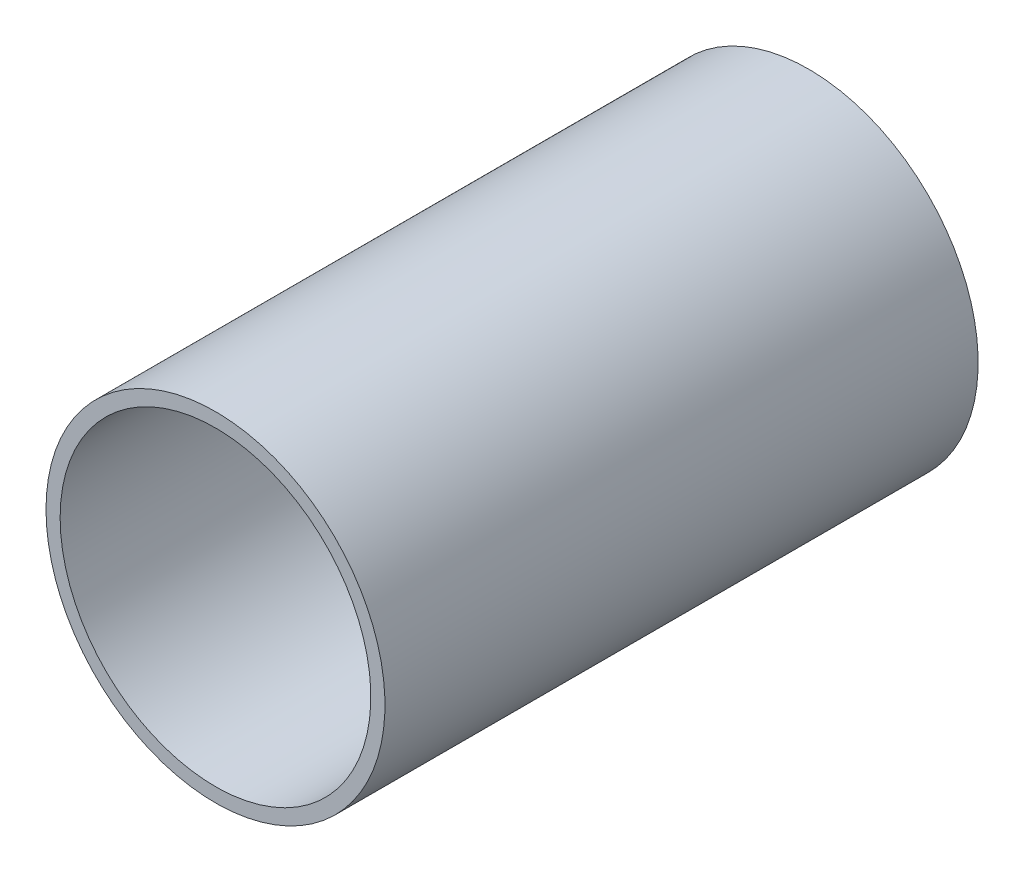
ISO-10303-21;
HEADER;
FILE_DESCRIPTION(('STEP AP214'),'2;1');
FILE_NAME('part.step','',(''),(''),'','','');
FILE_SCHEMA(('AUTOMOTIVE_DESIGN { 1 0 10303 214 1 1 1 1 }'));
ENDSEC;
DATA;
#1=APPLICATION_CONTEXT('core data for automotive mechanical design processes');
#2=APPLICATION_PROTOCOL_DEFINITION('international standard','automotive_design',2000,#1);
#3=PRODUCT_CONTEXT('',#1,'mechanical');
#4=PRODUCT('Part','Part','',(#3));
#5=PRODUCT_RELATED_PRODUCT_CATEGORY('part','',(#4));
#6=PRODUCT_DEFINITION_FORMATION('','',#4);
#7=PRODUCT_DEFINITION_CONTEXT('part definition',#1,'design');
#8=PRODUCT_DEFINITION('design','',#6,#7);
#9=PRODUCT_DEFINITION_SHAPE('','',#8);
#10=(LENGTH_UNIT() NAMED_UNIT(*) SI_UNIT(.MILLI.,.METRE.));
#11=(NAMED_UNIT(*) PLANE_ANGLE_UNIT() SI_UNIT($,.RADIAN.));
#12=(NAMED_UNIT(*) SI_UNIT($,.STERADIAN.) SOLID_ANGLE_UNIT());
#13=UNCERTAINTY_MEASURE_WITH_UNIT(LENGTH_MEASURE(1.E-05),#10,'distance_accuracy_value','');
#14=(GEOMETRIC_REPRESENTATION_CONTEXT(3) GLOBAL_UNCERTAINTY_ASSIGNED_CONTEXT((#13)) GLOBAL_UNIT_ASSIGNED_CONTEXT((#10,
#11,#12)) REPRESENTATION_CONTEXT('',''));
#15=CARTESIAN_POINT('',(0.,0.,0.));
#16=DIRECTION('',(0.,0.,1.));
#17=DIRECTION('',(1.,0.,0.));
#18=AXIS2_PLACEMENT_3D('',#15,#16,#17);
#19=CARTESIAN_POINT('',(0.,0.,42.));
#20=DIRECTION('',(0.,0.,1.));
#21=DIRECTION('',(1.,0.,0.));
#22=AXIS2_PLACEMENT_3D('',#19,#20,#21);
#23=PLANE('',#22);
#24=CARTESIAN_POINT('',(0.,0.,42.));
#25=DIRECTION('',(0.,0.,1.));
#26=DIRECTION('',(1.,0.,0.));
#27=AXIS2_PLACEMENT_3D('',#24,#25,#26);
#28=CIRCLE('',#27,12.);
#29=CARTESIAN_POINT('',(-12.,0.,42.));
#30=VERTEX_POINT('',#29);
#31=EDGE_CURVE('E10',#30,#30,#28,.T.);
#32=ORIENTED_EDGE('',*,*,#31,.T.);
#33=EDGE_LOOP('',(#32));
#34=FACE_BOUND('',#33,.T.);
#35=CARTESIAN_POINT('',(0.,0.,42.));
#36=DIRECTION('',(0.,0.,1.));
#37=DIRECTION('',(1.,0.,0.));
#38=AXIS2_PLACEMENT_3D('',#35,#36,#37);
#39=CIRCLE('',#38,11.);
#40=CARTESIAN_POINT('',(-11.,0.,42.));
#41=VERTEX_POINT('',#40);
#42=EDGE_CURVE('E54',#41,#41,#39,.T.);
#43=ORIENTED_EDGE('',*,*,#42,.F.);
#44=EDGE_LOOP('',(#43));
#45=FACE_BOUND('',#44,.T.);
#46=ADVANCED_FACE('F41',(#34,#45),#23,.T.);
#47=CARTESIAN_POINT('',(0.,0.,0.));
#48=DIRECTION('',(0.,0.,1.));
#49=DIRECTION('',(1.,0.,0.));
#50=AXIS2_PLACEMENT_3D('',#47,#48,#49);
#51=PLANE('',#50);
#52=CARTESIAN_POINT('',(0.,0.,0.));
#53=DIRECTION('',(0.,0.,1.));
#54=DIRECTION('',(1.,0.,0.));
#55=AXIS2_PLACEMENT_3D('',#52,#53,#54);
#56=CIRCLE('',#55,12.);
#57=CARTESIAN_POINT('',(-12.,0.,0.));
#58=VERTEX_POINT('',#57);
#59=EDGE_CURVE('E45',#58,#58,#56,.T.);
#60=ORIENTED_EDGE('',*,*,#59,.F.);
#61=EDGE_LOOP('',(#60));
#62=FACE_BOUND('',#61,.T.);
#63=CARTESIAN_POINT('',(0.,0.,0.));
#64=DIRECTION('',(0.,0.,1.));
#65=DIRECTION('',(1.,0.,0.));
#66=AXIS2_PLACEMENT_3D('',#63,#64,#65);
#67=CIRCLE('',#66,11.);
#68=CARTESIAN_POINT('',(-11.,0.,0.));
#69=VERTEX_POINT('',#68);
#70=EDGE_CURVE('E56',#69,#69,#67,.T.);
#71=ORIENTED_EDGE('',*,*,#70,.T.);
#72=EDGE_LOOP('',(#71));
#73=FACE_BOUND('',#72,.T.);
#74=ADVANCED_FACE('F68',(#62,#73),#51,.F.);
#75=CARTESIAN_POINT('',(0.,0.,42.));
#76=DIRECTION('',(0.,0.,-1.));
#77=DIRECTION('',(-1.,0.,0.));
#78=AXIS2_PLACEMENT_3D('',#75,#76,#77);
#79=CYLINDRICAL_SURFACE('',#78,12.);
#80=CARTESIAN_POINT('',(-12.,0.,42.));
#81=CARTESIAN_POINT('',(-12.,0.,41.5625));
#82=CARTESIAN_POINT('',(-12.,0.,41.125));
#83=CARTESIAN_POINT('',(-12.,0.,40.25));
#84=CARTESIAN_POINT('',(-12.,0.,39.8125));
#85=CARTESIAN_POINT('',(-12.,0.,38.9375));
#86=CARTESIAN_POINT('',(-12.,0.,38.5));
#87=CARTESIAN_POINT('',(-12.,0.,37.625));
#88=CARTESIAN_POINT('',(-12.,0.,37.1875));
#89=CARTESIAN_POINT('',(-12.,0.,36.3125));
#90=CARTESIAN_POINT('',(-12.,0.,35.875));
#91=CARTESIAN_POINT('',(-12.,0.,35.));
#92=CARTESIAN_POINT('',(-12.,0.,34.5625));
#93=CARTESIAN_POINT('',(-12.,0.,33.6875));
#94=CARTESIAN_POINT('',(-12.,0.,33.25));
#95=CARTESIAN_POINT('',(-12.,0.,32.375));
#96=CARTESIAN_POINT('',(-12.,0.,31.9375));
#97=CARTESIAN_POINT('',(-12.,0.,31.0625));
#98=CARTESIAN_POINT('',(-12.,0.,30.625));
#99=CARTESIAN_POINT('',(-12.,0.,29.75));
#100=CARTESIAN_POINT('',(-12.,0.,29.3125));
#101=CARTESIAN_POINT('',(-12.,0.,28.4375));
#102=CARTESIAN_POINT('',(-12.,0.,28.));
#103=CARTESIAN_POINT('',(-12.,0.,27.125));
#104=CARTESIAN_POINT('',(-12.,0.,26.6875));
#105=CARTESIAN_POINT('',(-12.,0.,25.8125));
#106=CARTESIAN_POINT('',(-12.,0.,25.375));
#107=CARTESIAN_POINT('',(-12.,0.,24.5));
#108=CARTESIAN_POINT('',(-12.,0.,24.0625));
#109=CARTESIAN_POINT('',(-12.,0.,23.1875));
#110=CARTESIAN_POINT('',(-12.,0.,22.75));
#111=CARTESIAN_POINT('',(-12.,0.,21.875));
#112=CARTESIAN_POINT('',(-12.,0.,21.4375));
#113=CARTESIAN_POINT('',(-12.,0.,20.5625));
#114=CARTESIAN_POINT('',(-12.,0.,20.125));
#115=CARTESIAN_POINT('',(-12.,0.,19.25));
#116=CARTESIAN_POINT('',(-12.,0.,18.8125));
#117=CARTESIAN_POINT('',(-12.,0.,17.9375));
#118=CARTESIAN_POINT('',(-12.,0.,17.5));
#119=CARTESIAN_POINT('',(-12.,0.,16.625));
#120=CARTESIAN_POINT('',(-12.,0.,16.1875));
#121=CARTESIAN_POINT('',(-12.,0.,15.3125));
#122=CARTESIAN_POINT('',(-12.,0.,14.875));
#123=CARTESIAN_POINT('',(-12.,0.,14.));
#124=CARTESIAN_POINT('',(-12.,0.,13.5625));
#125=CARTESIAN_POINT('',(-12.,0.,12.6875));
#126=CARTESIAN_POINT('',(-12.,0.,12.25));
#127=CARTESIAN_POINT('',(-12.,0.,11.375));
#128=CARTESIAN_POINT('',(-12.,0.,10.9375));
#129=CARTESIAN_POINT('',(-12.,0.,10.0625));
#130=CARTESIAN_POINT('',(-12.,0.,9.625));
#131=CARTESIAN_POINT('',(-12.,0.,8.75));
#132=CARTESIAN_POINT('',(-12.,0.,8.3125));
#133=CARTESIAN_POINT('',(-12.,0.,7.4375));
#134=CARTESIAN_POINT('',(-12.,0.,7.));
#135=CARTESIAN_POINT('',(-12.,0.,6.125));
#136=CARTESIAN_POINT('',(-12.,0.,5.6875));
#137=CARTESIAN_POINT('',(-12.,0.,4.8125));
#138=CARTESIAN_POINT('',(-12.,0.,4.375));
#139=CARTESIAN_POINT('',(-12.,0.,3.5));
#140=CARTESIAN_POINT('',(-12.,0.,3.0625));
#141=CARTESIAN_POINT('',(-12.,0.,2.1875));
#142=CARTESIAN_POINT('',(-12.,0.,1.75));
#143=CARTESIAN_POINT('',(-12.,0.,0.875000000000001));
#144=CARTESIAN_POINT('',(-12.,0.,0.4375));
#145=CARTESIAN_POINT('',(-12.,0.,0.));
#146=B_SPLINE_CURVE_WITH_KNOTS('',3,(#80,#81,#82,#83,#84,#85,#86,#87,#88,#89,#90,#91,#92,#93,
#94,#95,#96,#97,#98,#99,#100,#101,#102,#103,#104,#105,#106,#107,#108,#109,#110,#111,#112,#113,
#114,#115,#116,#117,#118,#119,#120,#121,#122,#123,#124,#125,#126,#127,#128,#129,#130,#131,#132,
#133,#134,#135,#136,#137,#138,#139,#140,#141,#142,#143,#144,#145),.UNSPECIFIED.,.F.,.F.,(4,2,2,
2,2,2,2,2,2,2,2,2,2,2,2,2,2,2,2,2,2,2,2,2,2,2,2,2,2,2,2,2,4),(0.,1.31249999999999,2.625,3.9375,
5.25,6.5625,7.87499999999999,9.18749999999999,10.5,11.8125,13.125,14.4375,15.75,17.0625,18.375,
19.6875,21.,22.3125,23.625,24.9375,26.25,27.5625,28.875,30.1875,31.5,32.8125,34.125,35.4375,
36.75,38.0625,39.375,40.6875,42.),.UNSPECIFIED.);
#147=EDGE_CURVE('BSEAM43',#30,#58,#146,.T.);
#148=ORIENTED_EDGE('',*,*,#31,.F.);
#149=ORIENTED_EDGE('',*,*,#59,.T.);
#150=ORIENTED_EDGE('',*,*,#147,.T.);
#151=ORIENTED_EDGE('',*,*,#147,.F.);
#152=EDGE_LOOP('',(#148,#150,#149,#151));
#153=FACE_BOUND('',#152,.T.);
#154=ADVANCED_FACE('F43',(#153),#79,.T.);
#155=CARTESIAN_POINT('',(0.,0.,42.));
#156=DIRECTION('',(0.,0.,-1.));
#157=DIRECTION('',(-1.,0.,0.));
#158=AXIS2_PLACEMENT_3D('',#155,#156,#157);
#159=CYLINDRICAL_SURFACE('',#158,11.);
#160=CARTESIAN_POINT('',(-11.,0.,42.));
#161=CARTESIAN_POINT('',(-11.,0.,41.5625));
#162=CARTESIAN_POINT('',(-11.,0.,41.125));
#163=CARTESIAN_POINT('',(-11.,0.,40.25));
#164=CARTESIAN_POINT('',(-11.,0.,39.8125));
#165=CARTESIAN_POINT('',(-11.,0.,38.9375));
#166=CARTESIAN_POINT('',(-11.,0.,38.5));
#167=CARTESIAN_POINT('',(-11.,0.,37.625));
#168=CARTESIAN_POINT('',(-11.,0.,37.1875));
#169=CARTESIAN_POINT('',(-11.,0.,36.3125));
#170=CARTESIAN_POINT('',(-11.,0.,35.875));
#171=CARTESIAN_POINT('',(-11.,0.,35.));
#172=CARTESIAN_POINT('',(-11.,0.,34.5625));
#173=CARTESIAN_POINT('',(-11.,0.,33.6875));
#174=CARTESIAN_POINT('',(-11.,0.,33.25));
#175=CARTESIAN_POINT('',(-11.,0.,32.375));
#176=CARTESIAN_POINT('',(-11.,0.,31.9375));
#177=CARTESIAN_POINT('',(-11.,0.,31.0625));
#178=CARTESIAN_POINT('',(-11.,0.,30.625));
#179=CARTESIAN_POINT('',(-11.,0.,29.75));
#180=CARTESIAN_POINT('',(-11.,0.,29.3125));
#181=CARTESIAN_POINT('',(-11.,0.,28.4375));
#182=CARTESIAN_POINT('',(-11.,0.,28.));
#183=CARTESIAN_POINT('',(-11.,0.,27.125));
#184=CARTESIAN_POINT('',(-11.,0.,26.6875));
#185=CARTESIAN_POINT('',(-11.,0.,25.8125));
#186=CARTESIAN_POINT('',(-11.,0.,25.375));
#187=CARTESIAN_POINT('',(-11.,0.,24.5));
#188=CARTESIAN_POINT('',(-11.,0.,24.0625));
#189=CARTESIAN_POINT('',(-11.,0.,23.1875));
#190=CARTESIAN_POINT('',(-11.,0.,22.75));
#191=CARTESIAN_POINT('',(-11.,0.,21.875));
#192=CARTESIAN_POINT('',(-11.,0.,21.4375));
#193=CARTESIAN_POINT('',(-11.,0.,20.5625));
#194=CARTESIAN_POINT('',(-11.,0.,20.125));
#195=CARTESIAN_POINT('',(-11.,0.,19.25));
#196=CARTESIAN_POINT('',(-11.,0.,18.8125));
#197=CARTESIAN_POINT('',(-11.,0.,17.9375));
#198=CARTESIAN_POINT('',(-11.,0.,17.5));
#199=CARTESIAN_POINT('',(-11.,0.,16.625));
#200=CARTESIAN_POINT('',(-11.,0.,16.1875));
#201=CARTESIAN_POINT('',(-11.,0.,15.3125));
#202=CARTESIAN_POINT('',(-11.,0.,14.875));
#203=CARTESIAN_POINT('',(-11.,0.,14.));
#204=CARTESIAN_POINT('',(-11.,0.,13.5625));
#205=CARTESIAN_POINT('',(-11.,0.,12.6875));
#206=CARTESIAN_POINT('',(-11.,0.,12.25));
#207=CARTESIAN_POINT('',(-11.,0.,11.375));
#208=CARTESIAN_POINT('',(-11.,0.,10.9375));
#209=CARTESIAN_POINT('',(-11.,0.,10.0625));
#210=CARTESIAN_POINT('',(-11.,0.,9.625));
#211=CARTESIAN_POINT('',(-11.,0.,8.75));
#212=CARTESIAN_POINT('',(-11.,0.,8.3125));
#213=CARTESIAN_POINT('',(-11.,0.,7.4375));
#214=CARTESIAN_POINT('',(-11.,0.,7.));
#215=CARTESIAN_POINT('',(-11.,0.,6.125));
#216=CARTESIAN_POINT('',(-11.,0.,5.6875));
#217=CARTESIAN_POINT('',(-11.,0.,4.8125));
#218=CARTESIAN_POINT('',(-11.,0.,4.375));
#219=CARTESIAN_POINT('',(-11.,0.,3.5));
#220=CARTESIAN_POINT('',(-11.,0.,3.0625));
#221=CARTESIAN_POINT('',(-11.,0.,2.1875));
#222=CARTESIAN_POINT('',(-11.,0.,1.75));
#223=CARTESIAN_POINT('',(-11.,0.,0.875000000000001));
#224=CARTESIAN_POINT('',(-11.,0.,0.4375));
#225=CARTESIAN_POINT('',(-11.,0.,0.));
#226=B_SPLINE_CURVE_WITH_KNOTS('',3,(#160,#161,#162,#163,#164,#165,#166,#167,#168,#169,#170,
#171,#172,#173,#174,#175,#176,#177,#178,#179,#180,#181,#182,#183,#184,#185,#186,#187,#188,#189,
#190,#191,#192,#193,#194,#195,#196,#197,#198,#199,#200,#201,#202,#203,#204,#205,#206,#207,#208,
#209,#210,#211,#212,#213,#214,#215,#216,#217,#218,#219,#220,#221,#222,#223,#224,#225),
.UNSPECIFIED.,.F.,.F.,(4,2,2,2,2,2,2,2,2,2,2,2,2,2,2,2,2,2,2,2,2,2,2,2,2,2,2,2,2,2,2,2,4),(0.,
1.3125,2.625,3.9375,5.25,6.56250000000001,7.875,9.1875,10.5,11.8125,13.125,14.4375,15.75,
17.0625,18.375,19.6875,21.,22.3125,23.625,24.9375,26.25,27.5625,28.875,30.1875,31.5,32.8125,
34.125,35.4375,36.75,38.0625,39.375,40.6875,42.),.UNSPECIFIED.);
#227=EDGE_CURVE('BSEAM64',#41,#69,#226,.T.);
#228=ORIENTED_EDGE('',*,*,#42,.T.);
#229=ORIENTED_EDGE('',*,*,#70,.F.);
#230=ORIENTED_EDGE('',*,*,#227,.T.);
#231=ORIENTED_EDGE('',*,*,#227,.F.);
#232=EDGE_LOOP('',(#228,#230,#229,#231));
#233=FACE_BOUND('',#232,.T.);
#234=ADVANCED_FACE('F64',(#233),#159,.F.);
#235=CLOSED_SHELL('',(#46,#74,#154,#234));
#236=MANIFOLD_SOLID_BREP('B2',#235);
#237=ADVANCED_BREP_SHAPE_REPRESENTATION('',(#18,#236),#14);
#238=SHAPE_DEFINITION_REPRESENTATION(#9,#237);
ENDSEC;
END-ISO-10303-21;
